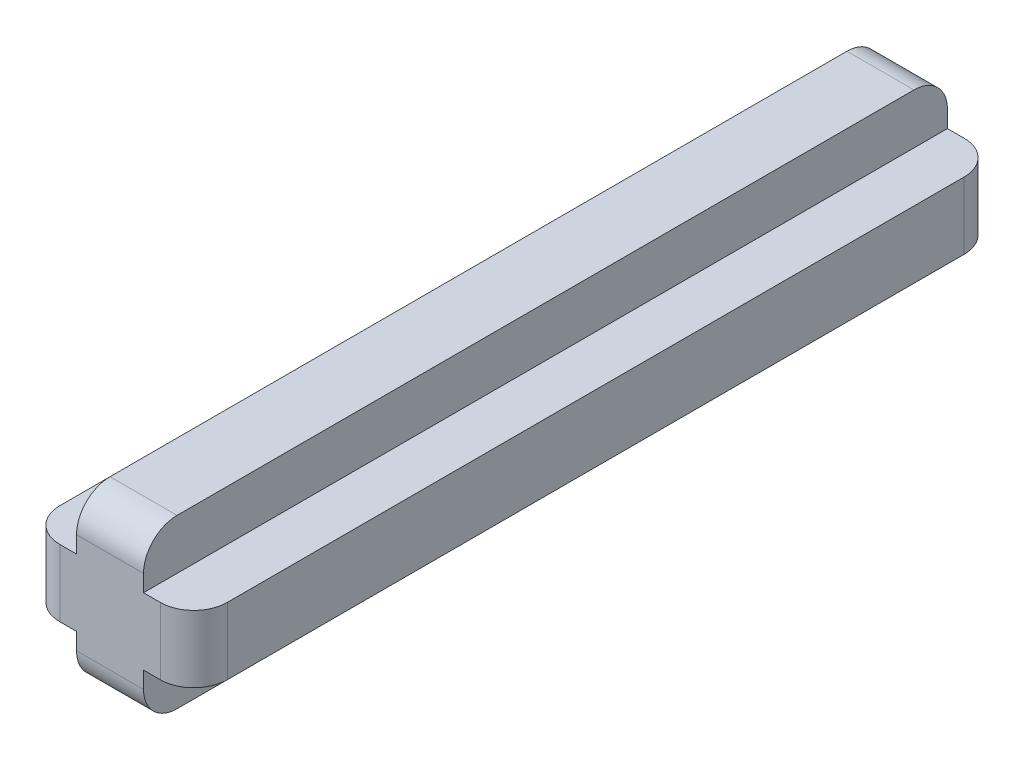
ISO-10303-21;
HEADER;
FILE_DESCRIPTION(('STEP AP214'),'2;1');
FILE_NAME('part.step','',(''),(''),'','','');
FILE_SCHEMA(('AUTOMOTIVE_DESIGN { 1 0 10303 214 1 1 1 1 }'));
ENDSEC;
DATA;
#1=APPLICATION_CONTEXT('core data for automotive mechanical design processes');
#2=APPLICATION_PROTOCOL_DEFINITION('international standard','automotive_design',2000,#1);
#3=PRODUCT_CONTEXT('',#1,'mechanical');
#4=PRODUCT('Part','Part','',(#3));
#5=PRODUCT_RELATED_PRODUCT_CATEGORY('part','',(#4));
#6=PRODUCT_DEFINITION_FORMATION('','',#4);
#7=PRODUCT_DEFINITION_CONTEXT('part definition',#1,'design');
#8=PRODUCT_DEFINITION('design','',#6,#7);
#9=PRODUCT_DEFINITION_SHAPE('','',#8);
#10=(LENGTH_UNIT() NAMED_UNIT(*) SI_UNIT(.MILLI.,.METRE.));
#11=(NAMED_UNIT(*) PLANE_ANGLE_UNIT() SI_UNIT($,.RADIAN.));
#12=(NAMED_UNIT(*) SI_UNIT($,.STERADIAN.) SOLID_ANGLE_UNIT());
#13=UNCERTAINTY_MEASURE_WITH_UNIT(LENGTH_MEASURE(1.E-05),#10,'distance_accuracy_value','');
#14=(GEOMETRIC_REPRESENTATION_CONTEXT(3) GLOBAL_UNCERTAINTY_ASSIGNED_CONTEXT((#13)) GLOBAL_UNIT_ASSIGNED_CONTEXT((#10,
#11,#12)) REPRESENTATION_CONTEXT('',''));
#15=CARTESIAN_POINT('',(0.,0.,0.));
#16=DIRECTION('',(0.,0.,1.));
#17=DIRECTION('',(1.,0.,0.));
#18=AXIS2_PLACEMENT_3D('',#15,#16,#17);
#19=CARTESIAN_POINT('',(5.,0.,24.));
#20=DIRECTION('',(0.,1.,0.));
#21=DIRECTION('',(0.,0.,1.));
#22=AXIS2_PLACEMENT_3D('',#19,#20,#21);
#23=PLANE('',#22);
#24=DIRECTION('',(0.,0.,1.));
#25=VECTOR('',#24,1.);
#26=CARTESIAN_POINT('',(1.5,0.,0.));
#27=LINE('',#26,#25);
#28=CARTESIAN_POINT('',(1.5,0.,1.));
#29=VERTEX_POINT('',#28);
#30=CARTESIAN_POINT('',(1.5,0.,23.));
#31=VERTEX_POINT('',#30);
#32=EDGE_CURVE('E199',#29,#31,#27,.T.);
#33=ORIENTED_EDGE('',*,*,#32,.F.);
#34=DIRECTION('',(1.,0.,0.));
#35=VECTOR('',#34,1.);
#36=CARTESIAN_POINT('',(3.5,0.,1.));
#37=LINE('',#36,#35);
#38=CARTESIAN_POINT('',(3.5,0.,1.));
#39=VERTEX_POINT('',#38);
#40=EDGE_CURVE('E315',#29,#39,#37,.T.);
#41=ORIENTED_EDGE('',*,*,#40,.T.);
#42=DIRECTION('',(0.,0.,1.));
#43=VECTOR('',#42,1.);
#44=CARTESIAN_POINT('',(3.5,0.,0.));
#45=LINE('',#44,#43);
#46=CARTESIAN_POINT('',(3.5,0.,23.));
#47=VERTEX_POINT('',#46);
#48=EDGE_CURVE('E215',#39,#47,#45,.T.);
#49=ORIENTED_EDGE('',*,*,#48,.T.);
#50=DIRECTION('',(1.,0.,0.));
#51=VECTOR('',#50,1.);
#52=CARTESIAN_POINT('',(5.,0.,23.));
#53=LINE('',#52,#51);
#54=EDGE_CURVE('E274',#47,#31,#53,.F.);
#55=ORIENTED_EDGE('',*,*,#54,.T.);
#56=EDGE_LOOP('',(#33,#41,#49,#55));
#57=FACE_BOUND('',#56,.T.);
#58=ADVANCED_FACE('F32',(#57),#23,.F.);
#59=CARTESIAN_POINT('',(5.,5.,24.));
#60=DIRECTION('',(-1.,0.,0.));
#61=DIRECTION('',(0.,0.,1.));
#62=AXIS2_PLACEMENT_3D('',#59,#60,#61);
#63=PLANE('',#62);
#64=DIRECTION('',(0.,0.,1.));
#65=VECTOR('',#64,1.);
#66=CARTESIAN_POINT('',(5.,1.5,0.));
#67=LINE('',#66,#65);
#68=CARTESIAN_POINT('',(5.,1.5,1.));
#69=VERTEX_POINT('',#68);
#70=CARTESIAN_POINT('',(5.,1.5,23.));
#71=VERTEX_POINT('',#70);
#72=EDGE_CURVE('E212',#69,#71,#67,.T.);
#73=ORIENTED_EDGE('',*,*,#72,.F.);
#74=DIRECTION('',(0.,1.,0.));
#75=VECTOR('',#74,1.);
#76=CARTESIAN_POINT('',(5.,3.5,1.));
#77=LINE('',#76,#75);
#78=CARTESIAN_POINT('',(5.,3.5,1.));
#79=VERTEX_POINT('',#78);
#80=EDGE_CURVE('E322',#69,#79,#77,.T.);
#81=ORIENTED_EDGE('',*,*,#80,.T.);
#82=DIRECTION('',(0.,0.,1.));
#83=VECTOR('',#82,1.);
#84=CARTESIAN_POINT('',(5.,3.5,0.));
#85=LINE('',#84,#83);
#86=CARTESIAN_POINT('',(5.,3.5,23.));
#87=VERTEX_POINT('',#86);
#88=EDGE_CURVE('E232',#79,#87,#85,.T.);
#89=ORIENTED_EDGE('',*,*,#88,.T.);
#90=DIRECTION('',(0.,1.,0.));
#91=VECTOR('',#90,1.);
#92=CARTESIAN_POINT('',(5.,5.,23.));
#93=LINE('',#92,#91);
#94=EDGE_CURVE('E282',#87,#71,#93,.F.);
#95=ORIENTED_EDGE('',*,*,#94,.T.);
#96=EDGE_LOOP('',(#73,#81,#89,#95));
#97=FACE_BOUND('',#96,.T.);
#98=ADVANCED_FACE('F330',(#97),#63,.F.);
#99=CARTESIAN_POINT('',(0.,5.,24.));
#100=DIRECTION('',(0.,-1.,0.));
#101=DIRECTION('',(0.,0.,-1.));
#102=AXIS2_PLACEMENT_3D('',#99,#100,#101);
#103=PLANE('',#102);
#104=DIRECTION('',(0.,0.,1.));
#105=VECTOR('',#104,1.);
#106=CARTESIAN_POINT('',(3.49999999999978,5.,0.));
#107=LINE('',#106,#105);
#108=CARTESIAN_POINT('',(3.49999999999978,5.,1.));
#109=VERTEX_POINT('',#108);
#110=CARTESIAN_POINT('',(3.49999999999978,5.,23.));
#111=VERTEX_POINT('',#110);
#112=EDGE_CURVE('E229',#109,#111,#107,.T.);
#113=ORIENTED_EDGE('',*,*,#112,.F.);
#114=DIRECTION('',(-1.,0.,0.));
#115=VECTOR('',#114,1.);
#116=CARTESIAN_POINT('',(1.5,5.,1.));
#117=LINE('',#116,#115);
#118=CARTESIAN_POINT('',(1.5,5.,1.));
#119=VERTEX_POINT('',#118);
#120=EDGE_CURVE('E295',#109,#119,#117,.T.);
#121=ORIENTED_EDGE('',*,*,#120,.T.);
#122=DIRECTION('',(0.,0.,1.));
#123=VECTOR('',#122,1.);
#124=CARTESIAN_POINT('',(1.5,5.,0.));
#125=LINE('',#124,#123);
#126=CARTESIAN_POINT('',(1.5,5.,23.));
#127=VERTEX_POINT('',#126);
#128=EDGE_CURVE('E248',#119,#127,#125,.T.);
#129=ORIENTED_EDGE('',*,*,#128,.T.);
#130=DIRECTION('',(-1.,0.,0.));
#131=VECTOR('',#130,1.);
#132=CARTESIAN_POINT('',(0.,5.,23.));
#133=LINE('',#132,#131);
#134=EDGE_CURVE('E290',#127,#111,#133,.F.);
#135=ORIENTED_EDGE('',*,*,#134,.T.);
#136=EDGE_LOOP('',(#113,#121,#129,#135));
#137=FACE_BOUND('',#136,.T.);
#138=ADVANCED_FACE('F382',(#137),#103,.F.);
#139=CARTESIAN_POINT('',(0.,0.,24.));
#140=DIRECTION('',(1.,0.,0.));
#141=DIRECTION('',(0.,0.,-1.));
#142=AXIS2_PLACEMENT_3D('',#139,#140,#141);
#143=PLANE('',#142);
#144=DIRECTION('',(0.,0.,1.));
#145=VECTOR('',#144,1.);
#146=CARTESIAN_POINT('',(0.,3.5,0.));
#147=LINE('',#146,#145);
#148=CARTESIAN_POINT('',(0.,3.5,1.));
#149=VERTEX_POINT('',#148);
#150=CARTESIAN_POINT('',(0.,3.5,23.));
#151=VERTEX_POINT('',#150);
#152=EDGE_CURVE('E245',#149,#151,#147,.T.);
#153=ORIENTED_EDGE('',*,*,#152,.F.);
#154=DIRECTION('',(0.,-1.,0.));
#155=VECTOR('',#154,1.);
#156=CARTESIAN_POINT('',(0.,1.5,1.));
#157=LINE('',#156,#155);
#158=CARTESIAN_POINT('',(0.,1.5,1.));
#159=VERTEX_POINT('',#158);
#160=EDGE_CURVE('E309',#149,#159,#157,.T.);
#161=ORIENTED_EDGE('',*,*,#160,.T.);
#162=DIRECTION('',(0.,0.,1.));
#163=VECTOR('',#162,1.);
#164=CARTESIAN_POINT('',(0.,1.5,0.));
#165=LINE('',#164,#163);
#166=CARTESIAN_POINT('',(0.,1.5,23.));
#167=VERTEX_POINT('',#166);
#168=EDGE_CURVE('E190',#159,#167,#165,.T.);
#169=ORIENTED_EDGE('',*,*,#168,.T.);
#170=DIRECTION('',(0.,-1.,0.));
#171=VECTOR('',#170,1.);
#172=CARTESIAN_POINT('',(0.,0.,23.));
#173=LINE('',#172,#171);
#174=EDGE_CURVE('E266',#167,#151,#173,.F.);
#175=ORIENTED_EDGE('',*,*,#174,.T.);
#176=EDGE_LOOP('',(#153,#161,#169,#175));
#177=FACE_BOUND('',#176,.T.);
#178=ADVANCED_FACE('F506',(#177),#143,.F.);
#179=CARTESIAN_POINT('',(0.,0.,24.));
#180=DIRECTION('',(0.,0.,-1.));
#181=DIRECTION('',(-1.,0.,0.));
#182=AXIS2_PLACEMENT_3D('',#179,#180,#181);
#183=PLANE('',#182);
#184=DIRECTION('',(1.,0.,0.));
#185=VECTOR('',#184,1.);
#186=CARTESIAN_POINT('',(2.55949442415234,3.5,24.));
#187=LINE('',#186,#185);
#188=CARTESIAN_POINT('',(1.,3.5,24.));
#189=VERTEX_POINT('',#188);
#190=CARTESIAN_POINT('',(1.5,3.5,24.));
#191=VERTEX_POINT('',#190);
#192=EDGE_CURVE('E231',#189,#191,#187,.T.);
#193=ORIENTED_EDGE('',*,*,#192,.F.);
#194=DIRECTION('',(0.,-1.,0.));
#195=VECTOR('',#194,1.);
#196=CARTESIAN_POINT('',(1.,0.,24.));
#197=LINE('',#196,#195);
#198=CARTESIAN_POINT('',(1.,1.5,24.));
#199=VERTEX_POINT('',#198);
#200=EDGE_CURVE('E260',#189,#199,#197,.T.);
#201=ORIENTED_EDGE('',*,*,#200,.T.);
#202=DIRECTION('',(-1.,0.,0.));
#203=VECTOR('',#202,1.);
#204=CARTESIAN_POINT('',(2.55949442415234,1.5,24.));
#205=LINE('',#204,#203);
#206=CARTESIAN_POINT('',(1.5,1.5,24.));
#207=VERTEX_POINT('',#206);
#208=EDGE_CURVE('E180',#207,#199,#205,.T.);
#209=ORIENTED_EDGE('',*,*,#208,.F.);
#210=DIRECTION('',(0.,1.,0.));
#211=VECTOR('',#210,1.);
#212=CARTESIAN_POINT('',(1.5,-5.93660430015725,24.));
#213=LINE('',#212,#211);
#214=CARTESIAN_POINT('',(1.5,1.,24.));
#215=VERTEX_POINT('',#214);
#216=EDGE_CURVE('E186',#215,#207,#213,.T.);
#217=ORIENTED_EDGE('',*,*,#216,.F.);
#218=DIRECTION('',(1.,0.,0.));
#219=VECTOR('',#218,1.);
#220=CARTESIAN_POINT('',(0.,1.,24.));
#221=LINE('',#220,#219);
#222=CARTESIAN_POINT('',(3.5,1.,24.));
#223=VERTEX_POINT('',#222);
#224=EDGE_CURVE('E257',#215,#223,#221,.T.);
#225=ORIENTED_EDGE('',*,*,#224,.T.);
#226=DIRECTION('',(0.,-1.,0.));
#227=VECTOR('',#226,1.);
#228=CARTESIAN_POINT('',(3.5,-5.93660430015725,24.));
#229=LINE('',#228,#227);
#230=CARTESIAN_POINT('',(3.5,1.5,24.));
#231=VERTEX_POINT('',#230);
#232=EDGE_CURVE('E206',#231,#223,#229,.T.);
#233=ORIENTED_EDGE('',*,*,#232,.F.);
#234=DIRECTION('',(-1.,0.,0.));
#235=VECTOR('',#234,1.);
#236=CARTESIAN_POINT('',(2.55949442415234,1.5,24.));
#237=LINE('',#236,#235);
#238=CARTESIAN_POINT('',(4.,1.5,24.));
#239=VERTEX_POINT('',#238);
#240=EDGE_CURVE('E201',#239,#231,#237,.T.);
#241=ORIENTED_EDGE('',*,*,#240,.F.);
#242=DIRECTION('',(0.,1.,0.));
#243=VECTOR('',#242,1.);
#244=CARTESIAN_POINT('',(4.,0.,24.));
#245=LINE('',#244,#243);
#246=CARTESIAN_POINT('',(4.,3.5,24.));
#247=VERTEX_POINT('',#246);
#248=EDGE_CURVE('E254',#239,#247,#245,.T.);
#249=ORIENTED_EDGE('',*,*,#248,.T.);
#250=DIRECTION('',(1.,0.,0.));
#251=VECTOR('',#250,1.);
#252=CARTESIAN_POINT('',(2.55949442415234,3.5,24.));
#253=LINE('',#252,#251);
#254=CARTESIAN_POINT('',(3.5,3.5,24.));
#255=VERTEX_POINT('',#254);
#256=EDGE_CURVE('E222',#255,#247,#253,.T.);
#257=ORIENTED_EDGE('',*,*,#256,.F.);
#258=DIRECTION('',(0.,-1.,0.));
#259=VECTOR('',#258,1.);
#260=CARTESIAN_POINT('',(3.5,-5.93660430015725,24.));
#261=LINE('',#260,#259);
#262=CARTESIAN_POINT('',(3.5,4.,24.));
#263=VERTEX_POINT('',#262);
#264=EDGE_CURVE('E214',#263,#255,#261,.T.);
#265=ORIENTED_EDGE('',*,*,#264,.F.);
#266=DIRECTION('',(-1.,0.,0.));
#267=VECTOR('',#266,1.);
#268=CARTESIAN_POINT('',(0.,4.,24.));
#269=LINE('',#268,#267);
#270=CARTESIAN_POINT('',(1.5,4.,24.));
#271=VERTEX_POINT('',#270);
#272=EDGE_CURVE('E247',#263,#271,#269,.T.);
#273=ORIENTED_EDGE('',*,*,#272,.T.);
#274=DIRECTION('',(0.,1.,0.));
#275=VECTOR('',#274,1.);
#276=CARTESIAN_POINT('',(1.5,-5.93660430015725,24.));
#277=LINE('',#276,#275);
#278=EDGE_CURVE('E239',#191,#271,#277,.T.);
#279=ORIENTED_EDGE('',*,*,#278,.F.);
#280=EDGE_LOOP('',(#193,#201,#209,#217,#225,#233,#241,#249,#257,#265,#273,#279));
#281=FACE_BOUND('',#280,.T.);
#282=ADVANCED_FACE('F341',(#281),#183,.F.);
#283=CARTESIAN_POINT('',(0.,0.,0.));
#284=DIRECTION('',(0.,0.,-1.));
#285=DIRECTION('',(-1.,0.,0.));
#286=AXIS2_PLACEMENT_3D('',#283,#284,#285);
#287=PLANE('',#286);
#288=DIRECTION('',(0.,1.,0.));
#289=VECTOR('',#288,1.);
#290=CARTESIAN_POINT('',(1.5,-5.93660430015725,0.));
#291=LINE('',#290,#289);
#292=CARTESIAN_POINT('',(1.5,3.5,0.));
#293=VERTEX_POINT('',#292);
#294=CARTESIAN_POINT('',(1.5,4.,0.));
#295=VERTEX_POINT('',#294);
#296=EDGE_CURVE('E238',#293,#295,#291,.T.);
#297=ORIENTED_EDGE('',*,*,#296,.T.);
#298=DIRECTION('',(-1.,0.,0.));
#299=VECTOR('',#298,1.);
#300=CARTESIAN_POINT('',(3.49999999999978,4.,0.));
#301=LINE('',#300,#299);
#302=CARTESIAN_POINT('',(3.5,4.,0.));
#303=VERTEX_POINT('',#302);
#304=EDGE_CURVE('E305',#295,#303,#301,.F.);
#305=ORIENTED_EDGE('',*,*,#304,.T.);
#306=DIRECTION('',(0.,-1.,0.));
#307=VECTOR('',#306,1.);
#308=CARTESIAN_POINT('',(3.5,-5.93660430015725,0.));
#309=LINE('',#308,#307);
#310=CARTESIAN_POINT('',(3.5,3.5,0.));
#311=VERTEX_POINT('',#310);
#312=EDGE_CURVE('E219',#303,#311,#309,.T.);
#313=ORIENTED_EDGE('',*,*,#312,.T.);
#314=DIRECTION('',(1.,0.,0.));
#315=VECTOR('',#314,1.);
#316=CARTESIAN_POINT('',(2.55949442415234,3.5,0.));
#317=LINE('',#316,#315);
#318=CARTESIAN_POINT('',(4.,3.5,0.));
#319=VERTEX_POINT('',#318);
#320=EDGE_CURVE('E221',#311,#319,#317,.T.);
#321=ORIENTED_EDGE('',*,*,#320,.T.);
#322=DIRECTION('',(0.,1.,0.));
#323=VECTOR('',#322,1.);
#324=CARTESIAN_POINT('',(4.,1.5,0.));
#325=LINE('',#324,#323);
#326=CARTESIAN_POINT('',(4.,1.5,0.));
#327=VERTEX_POINT('',#326);
#328=EDGE_CURVE('E300',#319,#327,#325,.F.);
#329=ORIENTED_EDGE('',*,*,#328,.T.);
#330=DIRECTION('',(-1.,0.,0.));
#331=VECTOR('',#330,1.);
#332=CARTESIAN_POINT('',(2.55949442415234,1.5,0.));
#333=LINE('',#332,#331);
#334=CARTESIAN_POINT('',(3.5,1.5,0.));
#335=VERTEX_POINT('',#334);
#336=EDGE_CURVE('E203',#327,#335,#333,.T.);
#337=ORIENTED_EDGE('',*,*,#336,.T.);
#338=DIRECTION('',(0.,-1.,0.));
#339=VECTOR('',#338,1.);
#340=CARTESIAN_POINT('',(3.5,-5.93660430015725,0.));
#341=LINE('',#340,#339);
#342=CARTESIAN_POINT('',(3.5,1.,0.));
#343=VERTEX_POINT('',#342);
#344=EDGE_CURVE('E205',#335,#343,#341,.T.);
#345=ORIENTED_EDGE('',*,*,#344,.T.);
#346=DIRECTION('',(1.,0.,0.));
#347=VECTOR('',#346,1.);
#348=CARTESIAN_POINT('',(1.5,1.,0.));
#349=LINE('',#348,#347);
#350=CARTESIAN_POINT('',(1.5,1.,0.));
#351=VERTEX_POINT('',#350);
#352=EDGE_CURVE('E177',#343,#351,#349,.F.);
#353=ORIENTED_EDGE('',*,*,#352,.T.);
#354=DIRECTION('',(0.,1.,0.));
#355=VECTOR('',#354,1.);
#356=CARTESIAN_POINT('',(1.5,-5.93660430015725,0.));
#357=LINE('',#356,#355);
#358=CARTESIAN_POINT('',(1.5,1.5,0.));
#359=VERTEX_POINT('',#358);
#360=EDGE_CURVE('E168',#351,#359,#357,.T.);
#361=ORIENTED_EDGE('',*,*,#360,.T.);
#362=DIRECTION('',(-1.,0.,0.));
#363=VECTOR('',#362,1.);
#364=CARTESIAN_POINT('',(2.55949442415234,1.5,0.));
#365=LINE('',#364,#363);
#366=CARTESIAN_POINT('',(1.,1.5,0.));
#367=VERTEX_POINT('',#366);
#368=EDGE_CURVE('E173',#359,#367,#365,.T.);
#369=ORIENTED_EDGE('',*,*,#368,.T.);
#370=DIRECTION('',(0.,-1.,0.));
#371=VECTOR('',#370,1.);
#372=CARTESIAN_POINT('',(1.,3.5,0.));
#373=LINE('',#372,#371);
#374=CARTESIAN_POINT('',(1.,3.5,0.));
#375=VERTEX_POINT('',#374);
#376=EDGE_CURVE('E303',#367,#375,#373,.F.);
#377=ORIENTED_EDGE('',*,*,#376,.T.);
#378=DIRECTION('',(1.,0.,0.));
#379=VECTOR('',#378,1.);
#380=CARTESIAN_POINT('',(2.55949442415234,3.5,0.));
#381=LINE('',#380,#379);
#382=EDGE_CURVE('E236',#375,#293,#381,.T.);
#383=ORIENTED_EDGE('',*,*,#382,.T.);
#384=EDGE_LOOP('',(#297,#305,#313,#321,#329,#337,#345,#353,#361,#369,#377,#383));
#385=FACE_BOUND('',#384,.T.);
#386=ADVANCED_FACE('F171',(#385),#287,.T.);
#387=CARTESIAN_POINT('',(2.55949442415234,3.5,0.));
#388=DIRECTION('',(0.,-1.,0.));
#389=DIRECTION('',(0.,0.,-1.));
#390=AXIS2_PLACEMENT_3D('',#387,#388,#389);
#391=PLANE('',#390);
#392=ORIENTED_EDGE('',*,*,#382,.F.);
#393=CARTESIAN_POINT('',(1.,3.5,1.));
#394=DIRECTION('',(0.,-1.,0.));
#395=DIRECTION('',(0.,0.,-1.));
#396=AXIS2_PLACEMENT_3D('',#393,#394,#395);
#397=CIRCLE('',#396,1.);
#398=EDGE_CURVE('E313',#375,#149,#397,.F.);
#399=ORIENTED_EDGE('',*,*,#398,.T.);
#400=ORIENTED_EDGE('',*,*,#152,.T.);
#401=CARTESIAN_POINT('',(1.,3.5,23.));
#402=DIRECTION('',(0.,-1.,0.));
#403=DIRECTION('',(0.,0.,-1.));
#404=AXIS2_PLACEMENT_3D('',#401,#402,#403);
#405=CIRCLE('',#404,1.);
#406=EDGE_CURVE('E269',#151,#189,#405,.F.);
#407=ORIENTED_EDGE('',*,*,#406,.T.);
#408=ORIENTED_EDGE('',*,*,#192,.T.);
#409=DIRECTION('',(0.,0.,1.));
#410=VECTOR('',#409,1.);
#411=CARTESIAN_POINT('',(1.5,3.5,0.));
#412=LINE('',#411,#410);
#413=EDGE_CURVE('E241',#293,#191,#412,.T.);
#414=ORIENTED_EDGE('',*,*,#413,.F.);
#415=EDGE_LOOP('',(#392,#399,#400,#407,#408,#414));
#416=FACE_BOUND('',#415,.T.);
#417=ADVANCED_FACE('F483',(#416),#391,.F.);
#418=CARTESIAN_POINT('',(1.5,-5.93660430015725,0.));
#419=DIRECTION('',(1.,0.,0.));
#420=DIRECTION('',(0.,0.,-1.));
#421=AXIS2_PLACEMENT_3D('',#418,#419,#420);
#422=PLANE('',#421);
#423=ORIENTED_EDGE('',*,*,#128,.F.);
#424=CARTESIAN_POINT('',(1.5,4.,1.));
#425=DIRECTION('',(1.,0.,0.));
#426=DIRECTION('',(0.,0.,-1.));
#427=AXIS2_PLACEMENT_3D('',#424,#425,#426);
#428=CIRCLE('',#427,1.);
#429=EDGE_CURVE('E298',#119,#295,#428,.F.);
#430=ORIENTED_EDGE('',*,*,#429,.T.);
#431=ORIENTED_EDGE('',*,*,#296,.F.);
#432=ORIENTED_EDGE('',*,*,#413,.T.);
#433=ORIENTED_EDGE('',*,*,#278,.T.);
#434=CARTESIAN_POINT('',(1.5,4.,23.));
#435=DIRECTION('',(1.,0.,0.));
#436=DIRECTION('',(0.,0.,-1.));
#437=AXIS2_PLACEMENT_3D('',#434,#435,#436);
#438=CIRCLE('',#437,1.);
#439=EDGE_CURVE('E287',#271,#127,#438,.F.);
#440=ORIENTED_EDGE('',*,*,#439,.T.);
#441=EDGE_LOOP('',(#423,#430,#431,#432,#433,#440));
#442=FACE_BOUND('',#441,.T.);
#443=ADVANCED_FACE('F354',(#442),#422,.F.);
#444=CARTESIAN_POINT('',(3.5,-5.93660430015725,0.));
#445=DIRECTION('',(-1.,0.,0.));
#446=DIRECTION('',(0.,-1.,0.));
#447=AXIS2_PLACEMENT_3D('',#444,#445,#446);
#448=PLANE('',#447);
#449=ORIENTED_EDGE('',*,*,#312,.F.);
#450=CARTESIAN_POINT('',(3.5,4.,1.));
#451=DIRECTION('',(-1.,0.,0.));
#452=DIRECTION('',(0.,-1.,0.));
#453=AXIS2_PLACEMENT_3D('',#450,#451,#452);
#454=CIRCLE('',#453,1.);
#455=EDGE_CURVE('E307',#303,#109,#454,.F.);
#456=ORIENTED_EDGE('',*,*,#455,.T.);
#457=ORIENTED_EDGE('',*,*,#112,.T.);
#458=CARTESIAN_POINT('',(3.5,4.,23.));
#459=DIRECTION('',(-1.,0.,0.));
#460=DIRECTION('',(0.,-1.,0.));
#461=AXIS2_PLACEMENT_3D('',#458,#459,#460);
#462=CIRCLE('',#461,1.);
#463=EDGE_CURVE('E293',#111,#263,#462,.F.);
#464=ORIENTED_EDGE('',*,*,#463,.T.);
#465=ORIENTED_EDGE('',*,*,#264,.T.);
#466=DIRECTION('',(0.,0.,1.));
#467=VECTOR('',#466,1.);
#468=CARTESIAN_POINT('',(3.5,3.5,0.));
#469=LINE('',#468,#467);
#470=EDGE_CURVE('E225',#311,#255,#469,.T.);
#471=ORIENTED_EDGE('',*,*,#470,.F.);
#472=EDGE_LOOP('',(#449,#456,#457,#464,#465,#471));
#473=FACE_BOUND('',#472,.T.);
#474=ADVANCED_FACE('F466',(#473),#448,.F.);
#475=CARTESIAN_POINT('',(2.55949442415234,3.5,0.));
#476=DIRECTION('',(0.,-1.,0.));
#477=DIRECTION('',(0.,0.,-1.));
#478=AXIS2_PLACEMENT_3D('',#475,#476,#477);
#479=PLANE('',#478);
#480=ORIENTED_EDGE('',*,*,#88,.F.);
#481=CARTESIAN_POINT('',(4.,3.5,1.));
#482=DIRECTION('',(0.,-1.,0.));
#483=DIRECTION('',(0.,0.,-1.));
#484=AXIS2_PLACEMENT_3D('',#481,#482,#483);
#485=CIRCLE('',#484,1.);
#486=EDGE_CURVE('E40',#79,#319,#485,.F.);
#487=ORIENTED_EDGE('',*,*,#486,.T.);
#488=ORIENTED_EDGE('',*,*,#320,.F.);
#489=ORIENTED_EDGE('',*,*,#470,.T.);
#490=ORIENTED_EDGE('',*,*,#256,.T.);
#491=CARTESIAN_POINT('',(4.,3.5,23.));
#492=DIRECTION('',(0.,-1.,0.));
#493=DIRECTION('',(0.,0.,-1.));
#494=AXIS2_PLACEMENT_3D('',#491,#492,#493);
#495=CIRCLE('',#494,1.);
#496=EDGE_CURVE('E279',#247,#87,#495,.F.);
#497=ORIENTED_EDGE('',*,*,#496,.T.);
#498=EDGE_LOOP('',(#480,#487,#488,#489,#490,#497));
#499=FACE_BOUND('',#498,.T.);
#500=ADVANCED_FACE('F326',(#499),#479,.F.);
#501=CARTESIAN_POINT('',(2.55949442415234,1.5,0.));
#502=DIRECTION('',(0.,1.,0.));
#503=DIRECTION('',(-1.,0.,0.));
#504=AXIS2_PLACEMENT_3D('',#501,#502,#503);
#505=PLANE('',#504);
#506=ORIENTED_EDGE('',*,*,#336,.F.);
#507=CARTESIAN_POINT('',(4.,1.5,1.));
#508=DIRECTION('',(0.,1.,0.));
#509=DIRECTION('',(-1.,0.,0.));
#510=AXIS2_PLACEMENT_3D('',#507,#508,#509);
#511=CIRCLE('',#510,1.);
#512=EDGE_CURVE('E11',#327,#69,#511,.F.);
#513=ORIENTED_EDGE('',*,*,#512,.T.);
#514=ORIENTED_EDGE('',*,*,#72,.T.);
#515=CARTESIAN_POINT('',(4.,1.5,23.));
#516=DIRECTION('',(0.,1.,0.));
#517=DIRECTION('',(-1.,0.,0.));
#518=AXIS2_PLACEMENT_3D('',#515,#516,#517);
#519=CIRCLE('',#518,1.);
#520=EDGE_CURVE('E285',#71,#239,#519,.F.);
#521=ORIENTED_EDGE('',*,*,#520,.T.);
#522=ORIENTED_EDGE('',*,*,#240,.T.);
#523=DIRECTION('',(0.,0.,1.));
#524=VECTOR('',#523,1.);
#525=CARTESIAN_POINT('',(3.5,1.5,0.));
#526=LINE('',#525,#524);
#527=EDGE_CURVE('E208',#335,#231,#526,.T.);
#528=ORIENTED_EDGE('',*,*,#527,.F.);
#529=EDGE_LOOP('',(#506,#513,#514,#521,#522,#528));
#530=FACE_BOUND('',#529,.T.);
#531=ADVANCED_FACE('F333',(#530),#505,.F.);
#532=CARTESIAN_POINT('',(3.5,-5.93660430015725,0.));
#533=DIRECTION('',(-1.,0.,0.));
#534=DIRECTION('',(0.,0.,1.));
#535=AXIS2_PLACEMENT_3D('',#532,#533,#534);
#536=PLANE('',#535);
#537=ORIENTED_EDGE('',*,*,#48,.F.);
#538=CARTESIAN_POINT('',(3.5,1.,1.));
#539=DIRECTION('',(-1.,0.,0.));
#540=DIRECTION('',(0.,0.,1.));
#541=AXIS2_PLACEMENT_3D('',#538,#539,#540);
#542=CIRCLE('',#541,1.);
#543=EDGE_CURVE('E318',#39,#343,#542,.F.);
#544=ORIENTED_EDGE('',*,*,#543,.T.);
#545=ORIENTED_EDGE('',*,*,#344,.F.);
#546=ORIENTED_EDGE('',*,*,#527,.T.);
#547=ORIENTED_EDGE('',*,*,#232,.T.);
#548=CARTESIAN_POINT('',(3.5,1.,23.));
#549=DIRECTION('',(-1.,0.,0.));
#550=DIRECTION('',(0.,0.,1.));
#551=AXIS2_PLACEMENT_3D('',#548,#549,#550);
#552=CIRCLE('',#551,1.);
#553=EDGE_CURVE('E271',#223,#47,#552,.F.);
#554=ORIENTED_EDGE('',*,*,#553,.T.);
#555=EDGE_LOOP('',(#537,#544,#545,#546,#547,#554));
#556=FACE_BOUND('',#555,.T.);
#557=ADVANCED_FACE('F370',(#556),#536,.F.);
#558=CARTESIAN_POINT('',(1.5,-5.93660430015725,0.));
#559=DIRECTION('',(1.,0.,0.));
#560=DIRECTION('',(0.,0.,-1.));
#561=AXIS2_PLACEMENT_3D('',#558,#559,#560);
#562=PLANE('',#561);
#563=ORIENTED_EDGE('',*,*,#360,.F.);
#564=CARTESIAN_POINT('',(1.5,1.,1.));
#565=DIRECTION('',(1.,0.,0.));
#566=DIRECTION('',(0.,0.,-1.));
#567=AXIS2_PLACEMENT_3D('',#564,#565,#566);
#568=CIRCLE('',#567,1.);
#569=EDGE_CURVE('E320',#351,#29,#568,.F.);
#570=ORIENTED_EDGE('',*,*,#569,.T.);
#571=ORIENTED_EDGE('',*,*,#32,.T.);
#572=CARTESIAN_POINT('',(1.5,1.,23.));
#573=DIRECTION('',(1.,0.,0.));
#574=DIRECTION('',(0.,0.,-1.));
#575=AXIS2_PLACEMENT_3D('',#572,#573,#574);
#576=CIRCLE('',#575,1.);
#577=EDGE_CURVE('E277',#31,#215,#576,.F.);
#578=ORIENTED_EDGE('',*,*,#577,.T.);
#579=ORIENTED_EDGE('',*,*,#216,.T.);
#580=DIRECTION('',(0.,0.,1.));
#581=VECTOR('',#580,1.);
#582=CARTESIAN_POINT('',(1.5,1.5,0.));
#583=LINE('',#582,#581);
#584=EDGE_CURVE('E183',#359,#207,#583,.T.);
#585=ORIENTED_EDGE('',*,*,#584,.F.);
#586=EDGE_LOOP('',(#563,#570,#571,#578,#579,#585));
#587=FACE_BOUND('',#586,.T.);
#588=ADVANCED_FACE('F184',(#587),#562,.F.);
#589=CARTESIAN_POINT('',(2.55949442415234,1.5,0.));
#590=DIRECTION('',(0.,1.,0.));
#591=DIRECTION('',(-1.,0.,0.));
#592=AXIS2_PLACEMENT_3D('',#589,#590,#591);
#593=PLANE('',#592);
#594=ORIENTED_EDGE('',*,*,#168,.F.);
#595=CARTESIAN_POINT('',(1.,1.5,1.));
#596=DIRECTION('',(0.,1.,0.));
#597=DIRECTION('',(-1.,0.,0.));
#598=AXIS2_PLACEMENT_3D('',#595,#596,#597);
#599=CIRCLE('',#598,1.);
#600=EDGE_CURVE('E194',#159,#367,#599,.F.);
#601=ORIENTED_EDGE('',*,*,#600,.T.);
#602=ORIENTED_EDGE('',*,*,#368,.F.);
#603=ORIENTED_EDGE('',*,*,#584,.T.);
#604=ORIENTED_EDGE('',*,*,#208,.T.);
#605=CARTESIAN_POINT('',(1.,1.5,23.));
#606=DIRECTION('',(0.,1.,0.));
#607=DIRECTION('',(-1.,0.,0.));
#608=AXIS2_PLACEMENT_3D('',#605,#606,#607);
#609=CIRCLE('',#608,1.);
#610=EDGE_CURVE('E263',#199,#167,#609,.F.);
#611=ORIENTED_EDGE('',*,*,#610,.T.);
#612=EDGE_LOOP('',(#594,#601,#602,#603,#604,#611));
#613=FACE_BOUND('',#612,.T.);
#614=ADVANCED_FACE('F193',(#613),#593,.F.);
#615=CARTESIAN_POINT('',(1.,0.,23.));
#616=DIRECTION('',(0.,-1.,0.));
#617=DIRECTION('',(0.,0.,-1.));
#618=AXIS2_PLACEMENT_3D('',#615,#616,#617);
#619=CYLINDRICAL_SURFACE('',#618,1.);
#620=ORIENTED_EDGE('',*,*,#406,.F.);
#621=ORIENTED_EDGE('',*,*,#174,.F.);
#622=ORIENTED_EDGE('',*,*,#610,.F.);
#623=ORIENTED_EDGE('',*,*,#200,.F.);
#624=EDGE_LOOP('',(#620,#621,#622,#623));
#625=FACE_BOUND('',#624,.T.);
#626=ADVANCED_FACE('F361',(#625),#619,.T.);
#627=CARTESIAN_POINT('',(0.,1.,23.));
#628=DIRECTION('',(1.,0.,0.));
#629=DIRECTION('',(0.,0.,-1.));
#630=AXIS2_PLACEMENT_3D('',#627,#628,#629);
#631=CYLINDRICAL_SURFACE('',#630,1.);
#632=ORIENTED_EDGE('',*,*,#577,.F.);
#633=ORIENTED_EDGE('',*,*,#54,.F.);
#634=ORIENTED_EDGE('',*,*,#553,.F.);
#635=ORIENTED_EDGE('',*,*,#224,.F.);
#636=EDGE_LOOP('',(#632,#633,#634,#635));
#637=FACE_BOUND('',#636,.T.);
#638=ADVANCED_FACE('F366',(#637),#631,.T.);
#639=CARTESIAN_POINT('',(4.,0.,23.));
#640=DIRECTION('',(0.,1.,0.));
#641=DIRECTION('',(0.,0.,1.));
#642=AXIS2_PLACEMENT_3D('',#639,#640,#641);
#643=CYLINDRICAL_SURFACE('',#642,1.);
#644=ORIENTED_EDGE('',*,*,#520,.F.);
#645=ORIENTED_EDGE('',*,*,#94,.F.);
#646=ORIENTED_EDGE('',*,*,#496,.F.);
#647=ORIENTED_EDGE('',*,*,#248,.F.);
#648=EDGE_LOOP('',(#644,#645,#646,#647));
#649=FACE_BOUND('',#648,.T.);
#650=ADVANCED_FACE('F343',(#649),#643,.T.);
#651=CARTESIAN_POINT('',(0.,4.,23.));
#652=DIRECTION('',(-1.,0.,0.));
#653=DIRECTION('',(0.,0.,1.));
#654=AXIS2_PLACEMENT_3D('',#651,#652,#653);
#655=CYLINDRICAL_SURFACE('',#654,1.);
#656=ORIENTED_EDGE('',*,*,#463,.F.);
#657=ORIENTED_EDGE('',*,*,#134,.F.);
#658=ORIENTED_EDGE('',*,*,#439,.F.);
#659=ORIENTED_EDGE('',*,*,#272,.F.);
#660=EDGE_LOOP('',(#656,#657,#658,#659));
#661=FACE_BOUND('',#660,.T.);
#662=ADVANCED_FACE('F350',(#661),#655,.T.);
#663=CARTESIAN_POINT('',(0.,4.,1.));
#664=DIRECTION('',(1.,0.,0.));
#665=DIRECTION('',(0.,0.,-1.));
#666=AXIS2_PLACEMENT_3D('',#663,#664,#665);
#667=CYLINDRICAL_SURFACE('',#666,1.);
#668=ORIENTED_EDGE('',*,*,#455,.F.);
#669=ORIENTED_EDGE('',*,*,#304,.F.);
#670=ORIENTED_EDGE('',*,*,#429,.F.);
#671=ORIENTED_EDGE('',*,*,#120,.F.);
#672=EDGE_LOOP('',(#668,#669,#670,#671));
#673=FACE_BOUND('',#672,.T.);
#674=ADVANCED_FACE('F394',(#673),#667,.T.);
#675=CARTESIAN_POINT('',(1.,0.,1.));
#676=DIRECTION('',(0.,1.,0.));
#677=DIRECTION('',(0.,0.,1.));
#678=AXIS2_PLACEMENT_3D('',#675,#676,#677);
#679=CYLINDRICAL_SURFACE('',#678,1.);
#680=ORIENTED_EDGE('',*,*,#398,.F.);
#681=ORIENTED_EDGE('',*,*,#376,.F.);
#682=ORIENTED_EDGE('',*,*,#600,.F.);
#683=ORIENTED_EDGE('',*,*,#160,.F.);
#684=EDGE_LOOP('',(#680,#681,#682,#683));
#685=FACE_BOUND('',#684,.T.);
#686=ADVANCED_FACE('F397',(#685),#679,.T.);
#687=CARTESIAN_POINT('',(5.,1.,1.));
#688=DIRECTION('',(-1.,0.,0.));
#689=DIRECTION('',(0.,0.,1.));
#690=AXIS2_PLACEMENT_3D('',#687,#688,#689);
#691=CYLINDRICAL_SURFACE('',#690,1.);
#692=ORIENTED_EDGE('',*,*,#569,.F.);
#693=ORIENTED_EDGE('',*,*,#352,.F.);
#694=ORIENTED_EDGE('',*,*,#543,.F.);
#695=ORIENTED_EDGE('',*,*,#40,.F.);
#696=EDGE_LOOP('',(#692,#693,#694,#695));
#697=FACE_BOUND('',#696,.T.);
#698=ADVANCED_FACE('F373',(#697),#691,.T.);
#699=CARTESIAN_POINT('',(4.,5.,1.));
#700=DIRECTION('',(0.,-1.,0.));
#701=DIRECTION('',(0.,0.,-1.));
#702=AXIS2_PLACEMENT_3D('',#699,#700,#701);
#703=CYLINDRICAL_SURFACE('',#702,1.);
#704=ORIENTED_EDGE('',*,*,#512,.F.);
#705=ORIENTED_EDGE('',*,*,#328,.F.);
#706=ORIENTED_EDGE('',*,*,#486,.F.);
#707=ORIENTED_EDGE('',*,*,#80,.F.);
#708=EDGE_LOOP('',(#704,#705,#706,#707));
#709=FACE_BOUND('',#708,.T.);
#710=ADVANCED_FACE('F34',(#709),#703,.T.);
#711=CLOSED_SHELL('',(#58,#98,#138,#178,#282,#386,#417,#443,#474,#500,#531,#557,#588,#614,#626,
#638,#650,#662,#674,#686,#698,#710));
#712=MANIFOLD_SOLID_BREP('B2',#711);
#713=ADVANCED_BREP_SHAPE_REPRESENTATION('',(#18,#712),#14);
#714=SHAPE_DEFINITION_REPRESENTATION(#9,#713);
ENDSEC;
END-ISO-10303-21;
